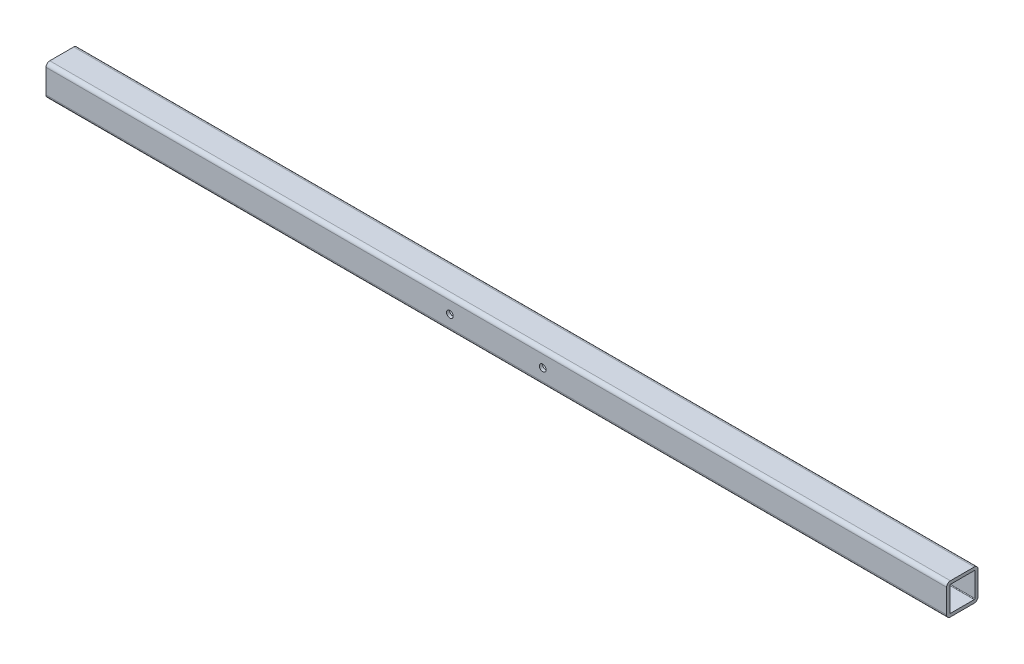
ISO-10303-21;
HEADER;
FILE_DESCRIPTION(('STEP AP214'),'2;1');
FILE_NAME('part.step','',(''),(''),'','','');
FILE_SCHEMA(('AUTOMOTIVE_DESIGN { 1 0 10303 214 1 1 1 1 }'));
ENDSEC;
DATA;
#1=APPLICATION_CONTEXT('core data for automotive mechanical design processes');
#2=APPLICATION_PROTOCOL_DEFINITION('international standard','automotive_design',2000,#1);
#3=PRODUCT_CONTEXT('',#1,'mechanical');
#4=PRODUCT('Part','Part','',(#3));
#5=PRODUCT_RELATED_PRODUCT_CATEGORY('part','',(#4));
#6=PRODUCT_DEFINITION_FORMATION('','',#4);
#7=PRODUCT_DEFINITION_CONTEXT('part definition',#1,'design');
#8=PRODUCT_DEFINITION('design','',#6,#7);
#9=PRODUCT_DEFINITION_SHAPE('','',#8);
#10=(LENGTH_UNIT() NAMED_UNIT(*) SI_UNIT(.MILLI.,.METRE.));
#11=(NAMED_UNIT(*) PLANE_ANGLE_UNIT() SI_UNIT($,.RADIAN.));
#12=(NAMED_UNIT(*) SI_UNIT($,.STERADIAN.) SOLID_ANGLE_UNIT());
#13=UNCERTAINTY_MEASURE_WITH_UNIT(LENGTH_MEASURE(1.E-05),#10,'distance_accuracy_value','');
#14=(GEOMETRIC_REPRESENTATION_CONTEXT(3) GLOBAL_UNCERTAINTY_ASSIGNED_CONTEXT((#13)) GLOBAL_UNIT_ASSIGNED_CONTEXT((#10,
#11,#12)) REPRESENTATION_CONTEXT('',''));
#15=CARTESIAN_POINT('',(0.,0.,0.));
#16=DIRECTION('',(0.,0.,1.));
#17=DIRECTION('',(1.,0.,0.));
#18=AXIS2_PLACEMENT_3D('',#15,#16,#17);
#19=CARTESIAN_POINT('',(0.,-27.94,-3.81));
#20=DIRECTION('',(1.,0.,0.));
#21=DIRECTION('',(0.,0.,-1.));
#22=AXIS2_PLACEMENT_3D('',#19,#20,#21);
#23=CYLINDRICAL_SURFACE('',#22,0.635);
#24=CARTESIAN_POINT('',(911.225,-27.94,-3.81));
#25=DIRECTION('',(1.,0.,0.));
#26=DIRECTION('',(0.,0.,-1.));
#27=AXIS2_PLACEMENT_3D('',#24,#25,#26);
#28=CIRCLE('',#27,0.635);
#29=CARTESIAN_POINT('',(911.225,-28.575,-3.81));
#30=VERTEX_POINT('',#29);
#31=CARTESIAN_POINT('',(911.225,-27.94,-3.175));
#32=VERTEX_POINT('',#31);
#33=EDGE_CURVE('E135',#30,#32,#28,.F.);
#34=ORIENTED_EDGE('',*,*,#33,.F.);
#35=DIRECTION('',(1.,0.,0.));
#36=VECTOR('',#35,1.);
#37=CARTESIAN_POINT('',(0.,-28.575,-3.81));
#38=LINE('',#37,#36);
#39=CARTESIAN_POINT('',(0.,-28.575,-3.81));
#40=VERTEX_POINT('',#39);
#41=EDGE_CURVE('E137',#40,#30,#38,.T.);
#42=ORIENTED_EDGE('',*,*,#41,.F.);
#43=CARTESIAN_POINT('',(0.,-27.94,-3.81));
#44=DIRECTION('',(1.,0.,0.));
#45=DIRECTION('',(0.,0.,-1.));
#46=AXIS2_PLACEMENT_3D('',#43,#44,#45);
#47=CIRCLE('',#46,0.635);
#48=CARTESIAN_POINT('',(0.,-27.94,-3.175));
#49=VERTEX_POINT('',#48);
#50=EDGE_CURVE('E20',#49,#40,#47,.T.);
#51=ORIENTED_EDGE('',*,*,#50,.F.);
#52=DIRECTION('',(-1.,0.,0.));
#53=VECTOR('',#52,1.);
#54=CARTESIAN_POINT('',(0.,-27.94,-3.175));
#55=LINE('',#54,#53);
#56=EDGE_CURVE('E211',#32,#49,#55,.T.);
#57=ORIENTED_EDGE('',*,*,#56,.F.);
#58=EDGE_LOOP('',(#34,#42,#51,#57));
#59=FACE_BOUND('',#58,.T.);
#60=ADVANCED_FACE('F17',(#59),#23,.F.);
#61=CARTESIAN_POINT('',(502.6025,-15.875,0.));
#62=DIRECTION('',(0.,0.,1.));
#63=DIRECTION('',(1.,0.,0.));
#64=AXIS2_PLACEMENT_3D('',#61,#62,#63);
#65=CYLINDRICAL_SURFACE('',#64,3.3655);
#66=CARTESIAN_POINT('',(502.6025,-15.875,-3.175));
#67=DIRECTION('',(0.,0.,1.));
#68=DIRECTION('',(1.,0.,0.));
#69=AXIS2_PLACEMENT_3D('',#66,#67,#68);
#70=CIRCLE('',#69,3.3655);
#71=CARTESIAN_POINT('',(505.968,-15.875,-3.175));
#72=VERTEX_POINT('',#71);
#73=EDGE_CURVE('E213',#72,#72,#70,.T.);
#74=ORIENTED_EDGE('',*,*,#73,.F.);
#75=EDGE_LOOP('',(#74));
#76=FACE_BOUND('',#75,.T.);
#77=CARTESIAN_POINT('',(502.6025,-15.875,0.));
#78=DIRECTION('',(0.,0.,1.));
#79=DIRECTION('',(1.,0.,0.));
#80=AXIS2_PLACEMENT_3D('',#77,#78,#79);
#81=CIRCLE('',#80,3.3655);
#82=CARTESIAN_POINT('',(505.968,-15.875,0.));
#83=VERTEX_POINT('',#82);
#84=EDGE_CURVE('E261',#83,#83,#81,.F.);
#85=ORIENTED_EDGE('',*,*,#84,.F.);
#86=EDGE_LOOP('',(#85));
#87=FACE_BOUND('',#86,.T.);
#88=ADVANCED_FACE('F513',(#76,#87),#65,.F.);
#89=CARTESIAN_POINT('',(408.6225,-15.875,0.));
#90=DIRECTION('',(0.,0.,1.));
#91=DIRECTION('',(1.,0.,0.));
#92=AXIS2_PLACEMENT_3D('',#89,#90,#91);
#93=CYLINDRICAL_SURFACE('',#92,3.3655);
#94=CARTESIAN_POINT('',(408.6225,-15.875,-3.175));
#95=DIRECTION('',(0.,0.,1.));
#96=DIRECTION('',(1.,0.,0.));
#97=AXIS2_PLACEMENT_3D('',#94,#95,#96);
#98=CIRCLE('',#97,3.3655);
#99=CARTESIAN_POINT('',(411.988,-15.875,-3.175));
#100=VERTEX_POINT('',#99);
#101=EDGE_CURVE('E210',#100,#100,#98,.T.);
#102=ORIENTED_EDGE('',*,*,#101,.F.);
#103=EDGE_LOOP('',(#102));
#104=FACE_BOUND('',#103,.T.);
#105=CARTESIAN_POINT('',(408.6225,-15.875,0.));
#106=DIRECTION('',(0.,0.,1.));
#107=DIRECTION('',(1.,0.,0.));
#108=AXIS2_PLACEMENT_3D('',#105,#106,#107);
#109=CIRCLE('',#108,3.3655);
#110=CARTESIAN_POINT('',(411.988,-15.875,0.));
#111=VERTEX_POINT('',#110);
#112=EDGE_CURVE('E234',#111,#111,#109,.F.);
#113=ORIENTED_EDGE('',*,*,#112,.F.);
#114=EDGE_LOOP('',(#113));
#115=FACE_BOUND('',#114,.T.);
#116=ADVANCED_FACE('F312',(#104,#115),#93,.F.);
#117=CARTESIAN_POINT('',(0.,-3.81,-3.81));
#118=DIRECTION('',(1.,0.,0.));
#119=DIRECTION('',(0.,0.,-1.));
#120=AXIS2_PLACEMENT_3D('',#117,#118,#119);
#121=CYLINDRICAL_SURFACE('',#120,0.635);
#122=CARTESIAN_POINT('',(911.225,-3.81,-3.81));
#123=DIRECTION('',(1.,0.,0.));
#124=DIRECTION('',(0.,0.,-1.));
#125=AXIS2_PLACEMENT_3D('',#122,#123,#124);
#126=CIRCLE('',#125,0.635);
#127=CARTESIAN_POINT('',(911.225,-3.81,-3.175));
#128=VERTEX_POINT('',#127);
#129=CARTESIAN_POINT('',(911.225,-3.175,-3.81));
#130=VERTEX_POINT('',#129);
#131=EDGE_CURVE('E272',#128,#130,#126,.F.);
#132=ORIENTED_EDGE('',*,*,#131,.F.);
#133=DIRECTION('',(-1.,0.,0.));
#134=VECTOR('',#133,1.);
#135=CARTESIAN_POINT('',(0.,-3.81,-3.175));
#136=LINE('',#135,#134);
#137=CARTESIAN_POINT('',(0.,-3.81,-3.175));
#138=VERTEX_POINT('',#137);
#139=EDGE_CURVE('E214',#138,#128,#136,.F.);
#140=ORIENTED_EDGE('',*,*,#139,.F.);
#141=CARTESIAN_POINT('',(0.,-3.81,-3.81));
#142=DIRECTION('',(1.,0.,0.));
#143=DIRECTION('',(0.,0.,-1.));
#144=AXIS2_PLACEMENT_3D('',#141,#142,#143);
#145=CIRCLE('',#144,0.635);
#146=CARTESIAN_POINT('',(0.,-3.175,-3.81));
#147=VERTEX_POINT('',#146);
#148=EDGE_CURVE('E274',#147,#138,#145,.T.);
#149=ORIENTED_EDGE('',*,*,#148,.F.);
#150=DIRECTION('',(1.,0.,0.));
#151=VECTOR('',#150,1.);
#152=CARTESIAN_POINT('',(0.,-3.175,-3.81));
#153=LINE('',#152,#151);
#154=EDGE_CURVE('E204',#130,#147,#153,.F.);
#155=ORIENTED_EDGE('',*,*,#154,.F.);
#156=EDGE_LOOP('',(#132,#140,#149,#155));
#157=FACE_BOUND('',#156,.T.);
#158=ADVANCED_FACE('F283',(#157),#121,.F.);
#159=CARTESIAN_POINT('',(0.,-27.94,-27.94));
#160=DIRECTION('',(1.,0.,0.));
#161=DIRECTION('',(0.,0.,-1.));
#162=AXIS2_PLACEMENT_3D('',#159,#160,#161);
#163=CYLINDRICAL_SURFACE('',#162,0.635);
#164=CARTESIAN_POINT('',(911.225,-27.94,-27.94));
#165=DIRECTION('',(1.,0.,0.));
#166=DIRECTION('',(0.,0.,-1.));
#167=AXIS2_PLACEMENT_3D('',#164,#165,#166);
#168=CIRCLE('',#167,0.635);
#169=CARTESIAN_POINT('',(911.225,-27.94,-28.575));
#170=VERTEX_POINT('',#169);
#171=CARTESIAN_POINT('',(911.225,-28.575,-27.94));
#172=VERTEX_POINT('',#171);
#173=EDGE_CURVE('E268',#170,#172,#168,.F.);
#174=ORIENTED_EDGE('',*,*,#173,.F.);
#175=DIRECTION('',(1.,0.,0.));
#176=VECTOR('',#175,1.);
#177=CARTESIAN_POINT('',(0.,-27.94,-28.575));
#178=LINE('',#177,#176);
#179=CARTESIAN_POINT('',(0.,-27.94,-28.575));
#180=VERTEX_POINT('',#179);
#181=EDGE_CURVE('E201',#180,#170,#178,.T.);
#182=ORIENTED_EDGE('',*,*,#181,.F.);
#183=CARTESIAN_POINT('',(0.,-27.94,-27.94));
#184=DIRECTION('',(1.,0.,0.));
#185=DIRECTION('',(0.,0.,-1.));
#186=AXIS2_PLACEMENT_3D('',#183,#184,#185);
#187=CIRCLE('',#186,0.635);
#188=CARTESIAN_POINT('',(0.,-28.575,-27.94));
#189=VERTEX_POINT('',#188);
#190=EDGE_CURVE('E270',#189,#180,#187,.T.);
#191=ORIENTED_EDGE('',*,*,#190,.F.);
#192=DIRECTION('',(1.,0.,0.));
#193=VECTOR('',#192,1.);
#194=CARTESIAN_POINT('',(0.,-28.575,-27.94));
#195=LINE('',#194,#193);
#196=EDGE_CURVE('E141',#172,#189,#195,.F.);
#197=ORIENTED_EDGE('',*,*,#196,.F.);
#198=EDGE_LOOP('',(#174,#182,#191,#197));
#199=FACE_BOUND('',#198,.T.);
#200=ADVANCED_FACE('F301',(#199),#163,.F.);
#201=CARTESIAN_POINT('',(0.,-3.81,-27.94));
#202=DIRECTION('',(1.,0.,0.));
#203=DIRECTION('',(0.,0.,-1.));
#204=AXIS2_PLACEMENT_3D('',#201,#202,#203);
#205=CYLINDRICAL_SURFACE('',#204,0.635);
#206=CARTESIAN_POINT('',(911.225,-3.81,-27.94));
#207=DIRECTION('',(1.,0.,0.));
#208=DIRECTION('',(0.,0.,-1.));
#209=AXIS2_PLACEMENT_3D('',#206,#207,#208);
#210=CIRCLE('',#209,0.635);
#211=CARTESIAN_POINT('',(911.225,-3.175,-27.94));
#212=VERTEX_POINT('',#211);
#213=CARTESIAN_POINT('',(911.225,-3.81,-28.575));
#214=VERTEX_POINT('',#213);
#215=EDGE_CURVE('E264',#212,#214,#210,.F.);
#216=ORIENTED_EDGE('',*,*,#215,.F.);
#217=DIRECTION('',(1.,0.,0.));
#218=VECTOR('',#217,1.);
#219=CARTESIAN_POINT('',(0.,-3.175,-27.94));
#220=LINE('',#219,#218);
#221=CARTESIAN_POINT('',(0.,-3.175,-27.94));
#222=VERTEX_POINT('',#221);
#223=EDGE_CURVE('E207',#222,#212,#220,.T.);
#224=ORIENTED_EDGE('',*,*,#223,.F.);
#225=CARTESIAN_POINT('',(0.,-3.81,-27.94));
#226=DIRECTION('',(1.,0.,0.));
#227=DIRECTION('',(0.,0.,-1.));
#228=AXIS2_PLACEMENT_3D('',#225,#226,#227);
#229=CIRCLE('',#228,0.635);
#230=CARTESIAN_POINT('',(0.,-3.81,-28.575));
#231=VERTEX_POINT('',#230);
#232=EDGE_CURVE('E266',#231,#222,#229,.T.);
#233=ORIENTED_EDGE('',*,*,#232,.F.);
#234=DIRECTION('',(1.,0.,0.));
#235=VECTOR('',#234,1.);
#236=CARTESIAN_POINT('',(0.,-3.81,-28.575));
#237=LINE('',#236,#235);
#238=EDGE_CURVE('E197',#214,#231,#237,.F.);
#239=ORIENTED_EDGE('',*,*,#238,.F.);
#240=EDGE_LOOP('',(#216,#224,#233,#239));
#241=FACE_BOUND('',#240,.T.);
#242=ADVANCED_FACE('F293',(#241),#205,.F.);
#243=CARTESIAN_POINT('',(502.6025,-15.875,0.));
#244=DIRECTION('',(0.,0.,1.));
#245=DIRECTION('',(1.,0.,0.));
#246=AXIS2_PLACEMENT_3D('',#243,#244,#245);
#247=CYLINDRICAL_SURFACE('',#246,3.3655);
#248=CARTESIAN_POINT('',(502.6025,-15.875,-28.575));
#249=DIRECTION('',(0.,0.,1.));
#250=DIRECTION('',(1.,0.,0.));
#251=AXIS2_PLACEMENT_3D('',#248,#249,#250);
#252=CIRCLE('',#251,3.3655);
#253=CARTESIAN_POINT('',(505.968,-15.875,-28.575));
#254=VERTEX_POINT('',#253);
#255=EDGE_CURVE('E200',#254,#254,#252,.F.);
#256=ORIENTED_EDGE('',*,*,#255,.F.);
#257=EDGE_LOOP('',(#256));
#258=FACE_BOUND('',#257,.T.);
#259=CARTESIAN_POINT('',(502.6025,-15.875,-31.75));
#260=DIRECTION('',(0.,0.,1.));
#261=DIRECTION('',(1.,0.,0.));
#262=AXIS2_PLACEMENT_3D('',#259,#260,#261);
#263=CIRCLE('',#262,3.3655);
#264=CARTESIAN_POINT('',(505.968,-15.875,-31.75));
#265=VERTEX_POINT('',#264);
#266=EDGE_CURVE('E225',#265,#265,#263,.T.);
#267=ORIENTED_EDGE('',*,*,#266,.F.);
#268=EDGE_LOOP('',(#267));
#269=FACE_BOUND('',#268,.T.);
#270=ADVANCED_FACE('F310',(#258,#269),#247,.F.);
#271=CARTESIAN_POINT('',(408.6225,-15.875,0.));
#272=DIRECTION('',(0.,0.,1.));
#273=DIRECTION('',(1.,0.,0.));
#274=AXIS2_PLACEMENT_3D('',#271,#272,#273);
#275=CYLINDRICAL_SURFACE('',#274,3.3655);
#276=CARTESIAN_POINT('',(408.6225,-15.875,-28.575));
#277=DIRECTION('',(0.,0.,1.));
#278=DIRECTION('',(1.,0.,0.));
#279=AXIS2_PLACEMENT_3D('',#276,#277,#278);
#280=CIRCLE('',#279,3.3655);
#281=CARTESIAN_POINT('',(411.988,-15.875,-28.575));
#282=VERTEX_POINT('',#281);
#283=EDGE_CURVE('E220',#282,#282,#280,.F.);
#284=ORIENTED_EDGE('',*,*,#283,.F.);
#285=EDGE_LOOP('',(#284));
#286=FACE_BOUND('',#285,.T.);
#287=CARTESIAN_POINT('',(408.6225,-15.875,-31.75));
#288=DIRECTION('',(0.,0.,1.));
#289=DIRECTION('',(1.,0.,0.));
#290=AXIS2_PLACEMENT_3D('',#287,#288,#289);
#291=CIRCLE('',#290,3.3655);
#292=CARTESIAN_POINT('',(411.988,-15.875,-31.75));
#293=VERTEX_POINT('',#292);
#294=EDGE_CURVE('E142',#293,#293,#291,.T.);
#295=ORIENTED_EDGE('',*,*,#294,.F.);
#296=EDGE_LOOP('',(#295));
#297=FACE_BOUND('',#296,.T.);
#298=ADVANCED_FACE('F361',(#286,#297),#275,.F.);
#299=CARTESIAN_POINT('',(0.,-3.81,0.));
#300=DIRECTION('',(0.,0.,1.));
#301=DIRECTION('',(1.,0.,0.));
#302=AXIS2_PLACEMENT_3D('',#299,#300,#301);
#303=PLANE('',#302);
#304=ORIENTED_EDGE('',*,*,#112,.T.);
#305=EDGE_LOOP('',(#304));
#306=FACE_BOUND('',#305,.T.);
#307=ORIENTED_EDGE('',*,*,#84,.T.);
#308=EDGE_LOOP('',(#307));
#309=FACE_BOUND('',#308,.T.);
#310=DIRECTION('',(1.,0.,0.));
#311=VECTOR('',#310,1.);
#312=CARTESIAN_POINT('',(0.,-3.81,0.));
#313=LINE('',#312,#311);
#314=CARTESIAN_POINT('',(0.,-3.81,0.));
#315=VERTEX_POINT('',#314);
#316=CARTESIAN_POINT('',(911.225,-3.81,0.));
#317=VERTEX_POINT('',#316);
#318=EDGE_CURVE('E218',#315,#317,#313,.T.);
#319=ORIENTED_EDGE('',*,*,#318,.F.);
#320=DIRECTION('',(0.,1.,0.));
#321=VECTOR('',#320,1.);
#322=CARTESIAN_POINT('',(0.,0.,0.));
#323=LINE('',#322,#321);
#324=CARTESIAN_POINT('',(0.,-27.94,0.));
#325=VERTEX_POINT('',#324);
#326=EDGE_CURVE('E162',#315,#325,#323,.F.);
#327=ORIENTED_EDGE('',*,*,#326,.T.);
#328=DIRECTION('',(1.,0.,0.));
#329=VECTOR('',#328,1.);
#330=CARTESIAN_POINT('',(0.,-27.94,0.));
#331=LINE('',#330,#329);
#332=CARTESIAN_POINT('',(911.225,-27.94,0.));
#333=VERTEX_POINT('',#332);
#334=EDGE_CURVE('E232',#333,#325,#331,.F.);
#335=ORIENTED_EDGE('',*,*,#334,.F.);
#336=DIRECTION('',(0.,1.,0.));
#337=VECTOR('',#336,1.);
#338=CARTESIAN_POINT('',(911.225,0.,0.));
#339=LINE('',#338,#337);
#340=EDGE_CURVE('E186',#317,#333,#339,.F.);
#341=ORIENTED_EDGE('',*,*,#340,.F.);
#342=EDGE_LOOP('',(#319,#327,#335,#341));
#343=FACE_BOUND('',#342,.T.);
#344=ADVANCED_FACE('F357',(#306,#309,#343),#303,.T.);
#345=CARTESIAN_POINT('',(0.,-27.94,-3.81));
#346=DIRECTION('',(1.,0.,0.));
#347=DIRECTION('',(0.,0.,-1.));
#348=AXIS2_PLACEMENT_3D('',#345,#346,#347);
#349=CYLINDRICAL_SURFACE('',#348,3.81);
#350=ORIENTED_EDGE('',*,*,#334,.T.);
#351=CARTESIAN_POINT('',(0.,-27.94,-3.81));
#352=DIRECTION('',(1.,0.,0.));
#353=DIRECTION('',(0.,0.,-1.));
#354=AXIS2_PLACEMENT_3D('',#351,#352,#353);
#355=CIRCLE('',#354,3.81);
#356=CARTESIAN_POINT('',(0.,-31.75,-3.81));
#357=VERTEX_POINT('',#356);
#358=EDGE_CURVE('E161',#325,#357,#355,.T.);
#359=ORIENTED_EDGE('',*,*,#358,.T.);
#360=DIRECTION('',(1.,0.,0.));
#361=VECTOR('',#360,1.);
#362=CARTESIAN_POINT('',(0.,-31.75,-3.81));
#363=LINE('',#362,#361);
#364=CARTESIAN_POINT('',(911.225,-31.75,-3.81));
#365=VERTEX_POINT('',#364);
#366=EDGE_CURVE('E229',#365,#357,#363,.F.);
#367=ORIENTED_EDGE('',*,*,#366,.F.);
#368=CARTESIAN_POINT('',(911.225,-27.94,-3.81));
#369=DIRECTION('',(1.,0.,0.));
#370=DIRECTION('',(0.,0.,-1.));
#371=AXIS2_PLACEMENT_3D('',#368,#369,#370);
#372=CIRCLE('',#371,3.81);
#373=EDGE_CURVE('E196',#333,#365,#372,.T.);
#374=ORIENTED_EDGE('',*,*,#373,.F.);
#375=EDGE_LOOP('',(#350,#359,#367,#374));
#376=FACE_BOUND('',#375,.T.);
#377=ADVANCED_FACE('F353',(#376),#349,.T.);
#378=CARTESIAN_POINT('',(0.,-31.75,-3.81));
#379=DIRECTION('',(0.,-1.,0.));
#380=DIRECTION('',(0.,0.,-1.));
#381=AXIS2_PLACEMENT_3D('',#378,#379,#380);
#382=PLANE('',#381);
#383=ORIENTED_EDGE('',*,*,#366,.T.);
#384=DIRECTION('',(0.,0.,-1.));
#385=VECTOR('',#384,1.);
#386=CARTESIAN_POINT('',(0.,-31.75,0.));
#387=LINE('',#386,#385);
#388=CARTESIAN_POINT('',(0.,-31.75,-27.94));
#389=VERTEX_POINT('',#388);
#390=EDGE_CURVE('E159',#357,#389,#387,.T.);
#391=ORIENTED_EDGE('',*,*,#390,.T.);
#392=DIRECTION('',(1.,0.,0.));
#393=VECTOR('',#392,1.);
#394=CARTESIAN_POINT('',(0.,-31.75,-27.94));
#395=LINE('',#394,#393);
#396=CARTESIAN_POINT('',(911.225,-31.75,-27.94));
#397=VERTEX_POINT('',#396);
#398=EDGE_CURVE('E226',#397,#389,#395,.F.);
#399=ORIENTED_EDGE('',*,*,#398,.F.);
#400=DIRECTION('',(0.,0.,-1.));
#401=VECTOR('',#400,1.);
#402=CARTESIAN_POINT('',(911.225,-31.75,0.));
#403=LINE('',#402,#401);
#404=EDGE_CURVE('E193',#365,#397,#403,.T.);
#405=ORIENTED_EDGE('',*,*,#404,.F.);
#406=EDGE_LOOP('',(#383,#391,#399,#405));
#407=FACE_BOUND('',#406,.T.);
#408=ADVANCED_FACE('F349',(#407),#382,.T.);
#409=CARTESIAN_POINT('',(0.,-27.94,-27.94));
#410=DIRECTION('',(1.,0.,0.));
#411=DIRECTION('',(0.,0.,-1.));
#412=AXIS2_PLACEMENT_3D('',#409,#410,#411);
#413=CYLINDRICAL_SURFACE('',#412,3.81);
#414=ORIENTED_EDGE('',*,*,#398,.T.);
#415=CARTESIAN_POINT('',(0.,-27.94,-27.94));
#416=DIRECTION('',(1.,0.,0.));
#417=DIRECTION('',(0.,0.,-1.));
#418=AXIS2_PLACEMENT_3D('',#415,#416,#417);
#419=CIRCLE('',#418,3.81);
#420=CARTESIAN_POINT('',(0.,-27.94,-31.75));
#421=VERTEX_POINT('',#420);
#422=EDGE_CURVE('E158',#389,#421,#419,.T.);
#423=ORIENTED_EDGE('',*,*,#422,.T.);
#424=DIRECTION('',(-1.,0.,0.));
#425=VECTOR('',#424,1.);
#426=CARTESIAN_POINT('',(0.,-27.94,-31.75));
#427=LINE('',#426,#425);
#428=CARTESIAN_POINT('',(911.225,-27.94,-31.75));
#429=VERTEX_POINT('',#428);
#430=EDGE_CURVE('E222',#429,#421,#427,.T.);
#431=ORIENTED_EDGE('',*,*,#430,.F.);
#432=CARTESIAN_POINT('',(911.225,-27.94,-27.94));
#433=DIRECTION('',(1.,0.,0.));
#434=DIRECTION('',(0.,0.,-1.));
#435=AXIS2_PLACEMENT_3D('',#432,#433,#434);
#436=CIRCLE('',#435,3.81);
#437=EDGE_CURVE('E192',#397,#429,#436,.T.);
#438=ORIENTED_EDGE('',*,*,#437,.F.);
#439=EDGE_LOOP('',(#414,#423,#431,#438));
#440=FACE_BOUND('',#439,.T.);
#441=ADVANCED_FACE('F345',(#440),#413,.T.);
#442=CARTESIAN_POINT('',(0.,-27.94,-31.75));
#443=DIRECTION('',(0.,0.,-1.));
#444=DIRECTION('',(-1.,0.,0.));
#445=AXIS2_PLACEMENT_3D('',#442,#443,#444);
#446=PLANE('',#445);
#447=ORIENTED_EDGE('',*,*,#294,.T.);
#448=EDGE_LOOP('',(#447));
#449=FACE_BOUND('',#448,.T.);
#450=ORIENTED_EDGE('',*,*,#266,.T.);
#451=EDGE_LOOP('',(#450));
#452=FACE_BOUND('',#451,.T.);
#453=ORIENTED_EDGE('',*,*,#430,.T.);
#454=DIRECTION('',(0.,1.,0.));
#455=VECTOR('',#454,1.);
#456=CARTESIAN_POINT('',(0.,0.,-31.75));
#457=LINE('',#456,#455);
#458=CARTESIAN_POINT('',(0.,-3.81,-31.75));
#459=VERTEX_POINT('',#458);
#460=EDGE_CURVE('E155',#421,#459,#457,.T.);
#461=ORIENTED_EDGE('',*,*,#460,.T.);
#462=DIRECTION('',(1.,0.,0.));
#463=VECTOR('',#462,1.);
#464=CARTESIAN_POINT('',(0.,-3.81,-31.75));
#465=LINE('',#464,#463);
#466=CARTESIAN_POINT('',(911.225,-3.81,-31.75));
#467=VERTEX_POINT('',#466);
#468=EDGE_CURVE('E164',#467,#459,#465,.F.);
#469=ORIENTED_EDGE('',*,*,#468,.F.);
#470=DIRECTION('',(0.,1.,0.));
#471=VECTOR('',#470,1.);
#472=CARTESIAN_POINT('',(911.225,0.,-31.75));
#473=LINE('',#472,#471);
#474=EDGE_CURVE('E190',#429,#467,#473,.T.);
#475=ORIENTED_EDGE('',*,*,#474,.F.);
#476=EDGE_LOOP('',(#453,#461,#469,#475));
#477=FACE_BOUND('',#476,.T.);
#478=ADVANCED_FACE('F342',(#449,#452,#477),#446,.T.);
#479=CARTESIAN_POINT('',(0.,-28.575,-27.94));
#480=DIRECTION('',(0.,1.,0.));
#481=DIRECTION('',(0.,0.,1.));
#482=AXIS2_PLACEMENT_3D('',#479,#480,#481);
#483=PLANE('',#482);
#484=ORIENTED_EDGE('',*,*,#196,.T.);
#485=DIRECTION('',(0.,0.,-1.));
#486=VECTOR('',#485,1.);
#487=CARTESIAN_POINT('',(0.,-28.575,0.));
#488=LINE('',#487,#486);
#489=EDGE_CURVE('E132',#189,#40,#488,.F.);
#490=ORIENTED_EDGE('',*,*,#489,.T.);
#491=ORIENTED_EDGE('',*,*,#41,.T.);
#492=DIRECTION('',(0.,0.,-1.));
#493=VECTOR('',#492,1.);
#494=CARTESIAN_POINT('',(911.225,-28.575,0.));
#495=LINE('',#494,#493);
#496=EDGE_CURVE('E184',#172,#30,#495,.F.);
#497=ORIENTED_EDGE('',*,*,#496,.F.);
#498=EDGE_LOOP('',(#484,#490,#491,#497));
#499=FACE_BOUND('',#498,.T.);
#500=ADVANCED_FACE('F145',(#499),#483,.T.);
#501=CARTESIAN_POINT('',(0.,-27.94,-3.175));
#502=DIRECTION('',(0.,0.,-1.));
#503=DIRECTION('',(-1.,0.,0.));
#504=AXIS2_PLACEMENT_3D('',#501,#502,#503);
#505=PLANE('',#504);
#506=ORIENTED_EDGE('',*,*,#101,.T.);
#507=EDGE_LOOP('',(#506));
#508=FACE_BOUND('',#507,.T.);
#509=ORIENTED_EDGE('',*,*,#73,.T.);
#510=EDGE_LOOP('',(#509));
#511=FACE_BOUND('',#510,.T.);
#512=ORIENTED_EDGE('',*,*,#56,.T.);
#513=DIRECTION('',(0.,1.,0.));
#514=VECTOR('',#513,1.);
#515=CARTESIAN_POINT('',(0.,0.,-3.175));
#516=LINE('',#515,#514);
#517=EDGE_CURVE('E134',#49,#138,#516,.T.);
#518=ORIENTED_EDGE('',*,*,#517,.T.);
#519=ORIENTED_EDGE('',*,*,#139,.T.);
#520=DIRECTION('',(0.,1.,0.));
#521=VECTOR('',#520,1.);
#522=CARTESIAN_POINT('',(911.225,0.,-3.175));
#523=LINE('',#522,#521);
#524=EDGE_CURVE('E181',#32,#128,#523,.T.);
#525=ORIENTED_EDGE('',*,*,#524,.F.);
#526=EDGE_LOOP('',(#512,#518,#519,#525));
#527=FACE_BOUND('',#526,.T.);
#528=ADVANCED_FACE('F280',(#508,#511,#527),#505,.T.);
#529=CARTESIAN_POINT('',(0.,-3.175,-3.81));
#530=DIRECTION('',(0.,-1.,0.));
#531=DIRECTION('',(0.,0.,-1.));
#532=AXIS2_PLACEMENT_3D('',#529,#530,#531);
#533=PLANE('',#532);
#534=ORIENTED_EDGE('',*,*,#154,.T.);
#535=DIRECTION('',(0.,0.,-1.));
#536=VECTOR('',#535,1.);
#537=CARTESIAN_POINT('',(0.,-3.175,0.));
#538=LINE('',#537,#536);
#539=EDGE_CURVE('E149',#147,#222,#538,.T.);
#540=ORIENTED_EDGE('',*,*,#539,.T.);
#541=ORIENTED_EDGE('',*,*,#223,.T.);
#542=DIRECTION('',(0.,0.,-1.));
#543=VECTOR('',#542,1.);
#544=CARTESIAN_POINT('',(911.225,-3.175,0.));
#545=LINE('',#544,#543);
#546=EDGE_CURVE('E178',#130,#212,#545,.T.);
#547=ORIENTED_EDGE('',*,*,#546,.F.);
#548=EDGE_LOOP('',(#534,#540,#541,#547));
#549=FACE_BOUND('',#548,.T.);
#550=ADVANCED_FACE('F288',(#549),#533,.T.);
#551=CARTESIAN_POINT('',(0.,-3.81,-28.575));
#552=DIRECTION('',(0.,0.,1.));
#553=DIRECTION('',(1.,0.,0.));
#554=AXIS2_PLACEMENT_3D('',#551,#552,#553);
#555=PLANE('',#554);
#556=ORIENTED_EDGE('',*,*,#283,.T.);
#557=EDGE_LOOP('',(#556));
#558=FACE_BOUND('',#557,.T.);
#559=ORIENTED_EDGE('',*,*,#255,.T.);
#560=EDGE_LOOP('',(#559));
#561=FACE_BOUND('',#560,.T.);
#562=ORIENTED_EDGE('',*,*,#238,.T.);
#563=DIRECTION('',(0.,1.,0.));
#564=VECTOR('',#563,1.);
#565=CARTESIAN_POINT('',(0.,0.,-28.575));
#566=LINE('',#565,#564);
#567=EDGE_CURVE('E171',#231,#180,#566,.F.);
#568=ORIENTED_EDGE('',*,*,#567,.T.);
#569=ORIENTED_EDGE('',*,*,#181,.T.);
#570=DIRECTION('',(0.,1.,0.));
#571=VECTOR('',#570,1.);
#572=CARTESIAN_POINT('',(911.225,0.,-28.575));
#573=LINE('',#572,#571);
#574=EDGE_CURVE('E174',#214,#170,#573,.F.);
#575=ORIENTED_EDGE('',*,*,#574,.F.);
#576=EDGE_LOOP('',(#562,#568,#569,#575));
#577=FACE_BOUND('',#576,.T.);
#578=ADVANCED_FACE('F298',(#558,#561,#577),#555,.T.);
#579=CARTESIAN_POINT('',(0.,-3.81,-3.81));
#580=DIRECTION('',(1.,0.,0.));
#581=DIRECTION('',(0.,0.,-1.));
#582=AXIS2_PLACEMENT_3D('',#579,#580,#581);
#583=CYLINDRICAL_SURFACE('',#582,3.81);
#584=DIRECTION('',(1.,0.,0.));
#585=VECTOR('',#584,1.);
#586=CARTESIAN_POINT('',(0.,0.,-3.81));
#587=LINE('',#586,#585);
#588=CARTESIAN_POINT('',(0.,0.,-3.81));
#589=VERTEX_POINT('',#588);
#590=CARTESIAN_POINT('',(911.225,0.,-3.81));
#591=VERTEX_POINT('',#590);
#592=EDGE_CURVE('E168',#589,#591,#587,.T.);
#593=ORIENTED_EDGE('',*,*,#592,.F.);
#594=CARTESIAN_POINT('',(0.,-3.81,-3.81));
#595=DIRECTION('',(1.,0.,0.));
#596=DIRECTION('',(0.,0.,-1.));
#597=AXIS2_PLACEMENT_3D('',#594,#595,#596);
#598=CIRCLE('',#597,3.81);
#599=EDGE_CURVE('E147',#589,#315,#598,.T.);
#600=ORIENTED_EDGE('',*,*,#599,.T.);
#601=ORIENTED_EDGE('',*,*,#318,.T.);
#602=CARTESIAN_POINT('',(911.225,-3.81,-3.81));
#603=DIRECTION('',(1.,0.,0.));
#604=DIRECTION('',(0.,0.,-1.));
#605=AXIS2_PLACEMENT_3D('',#602,#603,#604);
#606=CIRCLE('',#605,3.81);
#607=EDGE_CURVE('E189',#591,#317,#606,.T.);
#608=ORIENTED_EDGE('',*,*,#607,.F.);
#609=EDGE_LOOP('',(#593,#600,#601,#608));
#610=FACE_BOUND('',#609,.T.);
#611=ADVANCED_FACE('F328',(#610),#583,.T.);
#612=CARTESIAN_POINT('',(911.225,0.,0.));
#613=DIRECTION('',(1.,0.,0.));
#614=DIRECTION('',(0.,0.,-1.));
#615=AXIS2_PLACEMENT_3D('',#612,#613,#614);
#616=PLANE('',#615);
#617=ORIENTED_EDGE('',*,*,#574,.T.);
#618=ORIENTED_EDGE('',*,*,#173,.T.);
#619=ORIENTED_EDGE('',*,*,#496,.T.);
#620=ORIENTED_EDGE('',*,*,#33,.T.);
#621=ORIENTED_EDGE('',*,*,#524,.T.);
#622=ORIENTED_EDGE('',*,*,#131,.T.);
#623=ORIENTED_EDGE('',*,*,#546,.T.);
#624=ORIENTED_EDGE('',*,*,#215,.T.);
#625=EDGE_LOOP('',(#617,#618,#619,#620,#621,#622,#623,#624));
#626=FACE_BOUND('',#625,.T.);
#627=ORIENTED_EDGE('',*,*,#607,.T.);
#628=ORIENTED_EDGE('',*,*,#340,.T.);
#629=ORIENTED_EDGE('',*,*,#373,.T.);
#630=ORIENTED_EDGE('',*,*,#404,.T.);
#631=ORIENTED_EDGE('',*,*,#437,.T.);
#632=ORIENTED_EDGE('',*,*,#474,.T.);
#633=CARTESIAN_POINT('',(911.225,-3.81,-27.94));
#634=DIRECTION('',(1.,0.,0.));
#635=DIRECTION('',(0.,0.,-1.));
#636=AXIS2_PLACEMENT_3D('',#633,#634,#635);
#637=CIRCLE('',#636,3.81);
#638=CARTESIAN_POINT('',(911.225,0.,-27.94));
#639=VERTEX_POINT('',#638);
#640=EDGE_CURVE('E177',#639,#467,#637,.F.);
#641=ORIENTED_EDGE('',*,*,#640,.F.);
#642=DIRECTION('',(0.,0.,1.));
#643=VECTOR('',#642,1.);
#644=CARTESIAN_POINT('',(911.225,0.,-27.94));
#645=LINE('',#644,#643);
#646=EDGE_CURVE('E166',#591,#639,#645,.F.);
#647=ORIENTED_EDGE('',*,*,#646,.F.);
#648=EDGE_LOOP('',(#627,#628,#629,#630,#631,#632,#641,#647));
#649=FACE_BOUND('',#648,.T.);
#650=ADVANCED_FACE('F276',(#626,#649),#616,.T.);
#651=CARTESIAN_POINT('',(0.,-3.81,-27.94));
#652=DIRECTION('',(1.,0.,0.));
#653=DIRECTION('',(0.,0.,-1.));
#654=AXIS2_PLACEMENT_3D('',#651,#652,#653);
#655=CYLINDRICAL_SURFACE('',#654,3.81);
#656=ORIENTED_EDGE('',*,*,#468,.T.);
#657=CARTESIAN_POINT('',(0.,-3.81,-27.94));
#658=DIRECTION('',(1.,0.,0.));
#659=DIRECTION('',(0.,0.,-1.));
#660=AXIS2_PLACEMENT_3D('',#657,#658,#659);
#661=CIRCLE('',#660,3.81);
#662=CARTESIAN_POINT('',(0.,0.,-27.94));
#663=VERTEX_POINT('',#662);
#664=EDGE_CURVE('E35',#459,#663,#661,.T.);
#665=ORIENTED_EDGE('',*,*,#664,.T.);
#666=DIRECTION('',(1.,0.,0.));
#667=VECTOR('',#666,1.);
#668=CARTESIAN_POINT('',(0.,0.,-27.94));
#669=LINE('',#668,#667);
#670=EDGE_CURVE('E26',#639,#663,#669,.F.);
#671=ORIENTED_EDGE('',*,*,#670,.F.);
#672=ORIENTED_EDGE('',*,*,#640,.T.);
#673=EDGE_LOOP('',(#656,#665,#671,#672));
#674=FACE_BOUND('',#673,.T.);
#675=ADVANCED_FACE('F321',(#674),#655,.T.);
#676=CARTESIAN_POINT('',(0.,0.,0.));
#677=DIRECTION('',(1.,0.,0.));
#678=DIRECTION('',(0.,0.,-1.));
#679=AXIS2_PLACEMENT_3D('',#676,#677,#678);
#680=PLANE('',#679);
#681=ORIENTED_EDGE('',*,*,#232,.T.);
#682=ORIENTED_EDGE('',*,*,#539,.F.);
#683=ORIENTED_EDGE('',*,*,#148,.T.);
#684=ORIENTED_EDGE('',*,*,#517,.F.);
#685=ORIENTED_EDGE('',*,*,#50,.T.);
#686=ORIENTED_EDGE('',*,*,#489,.F.);
#687=ORIENTED_EDGE('',*,*,#190,.T.);
#688=ORIENTED_EDGE('',*,*,#567,.F.);
#689=EDGE_LOOP('',(#681,#682,#683,#684,#685,#686,#687,#688));
#690=FACE_BOUND('',#689,.T.);
#691=DIRECTION('',(0.,0.,1.));
#692=VECTOR('',#691,1.);
#693=CARTESIAN_POINT('',(0.,0.,-27.94));
#694=LINE('',#693,#692);
#695=EDGE_CURVE('E11',#663,#589,#694,.T.);
#696=ORIENTED_EDGE('',*,*,#695,.F.);
#697=ORIENTED_EDGE('',*,*,#664,.F.);
#698=ORIENTED_EDGE('',*,*,#460,.F.);
#699=ORIENTED_EDGE('',*,*,#422,.F.);
#700=ORIENTED_EDGE('',*,*,#390,.F.);
#701=ORIENTED_EDGE('',*,*,#358,.F.);
#702=ORIENTED_EDGE('',*,*,#326,.F.);
#703=ORIENTED_EDGE('',*,*,#599,.F.);
#704=EDGE_LOOP('',(#696,#697,#698,#699,#700,#701,#702,#703));
#705=FACE_BOUND('',#704,.T.);
#706=ADVANCED_FACE('F129',(#690,#705),#680,.F.);
#707=CARTESIAN_POINT('',(0.,0.,-27.94));
#708=DIRECTION('',(0.,1.,0.));
#709=DIRECTION('',(0.,0.,1.));
#710=AXIS2_PLACEMENT_3D('',#707,#708,#709);
#711=PLANE('',#710);
#712=ORIENTED_EDGE('',*,*,#670,.T.);
#713=ORIENTED_EDGE('',*,*,#695,.T.);
#714=ORIENTED_EDGE('',*,*,#592,.T.);
#715=ORIENTED_EDGE('',*,*,#646,.T.);
#716=EDGE_LOOP('',(#712,#713,#714,#715));
#717=FACE_BOUND('',#716,.T.);
#718=ADVANCED_FACE('F314',(#717),#711,.T.);
#719=CLOSED_SHELL('',(#60,#88,#116,#158,#200,#242,#270,#298,#344,#377,#408,#441,#478,#500,#528,
#550,#578,#611,#650,#675,#706,#718));
#720=MANIFOLD_SOLID_BREP('B1',#719);
#721=ADVANCED_BREP_SHAPE_REPRESENTATION('',(#18,#720),#14);
#722=SHAPE_DEFINITION_REPRESENTATION(#9,#721);
ENDSEC;
END-ISO-10303-21;
